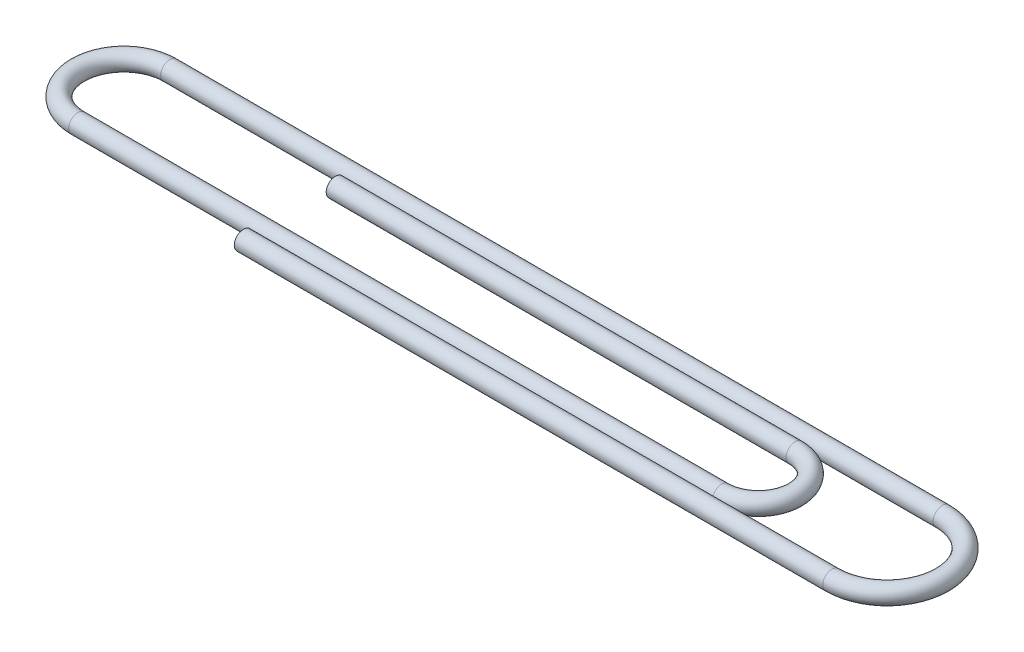
ISO-10303-21;
HEADER;
FILE_DESCRIPTION(('STEP AP214'),'2;1');
FILE_NAME('part.step','',(''),(''),'','','');
FILE_SCHEMA(('AUTOMOTIVE_DESIGN { 1 0 10303 214 1 1 1 1 }'));
ENDSEC;
DATA;
#1=APPLICATION_CONTEXT('core data for automotive mechanical design processes');
#2=APPLICATION_PROTOCOL_DEFINITION('international standard','automotive_design',2000,#1);
#3=PRODUCT_CONTEXT('',#1,'mechanical');
#4=PRODUCT('Part','Part','',(#3));
#5=PRODUCT_RELATED_PRODUCT_CATEGORY('part','',(#4));
#6=PRODUCT_DEFINITION_FORMATION('','',#4);
#7=PRODUCT_DEFINITION_CONTEXT('part definition',#1,'design');
#8=PRODUCT_DEFINITION('design','',#6,#7);
#9=PRODUCT_DEFINITION_SHAPE('','',#8);
#10=(LENGTH_UNIT() NAMED_UNIT(*) SI_UNIT(.MILLI.,.METRE.));
#11=(NAMED_UNIT(*) PLANE_ANGLE_UNIT() SI_UNIT($,.RADIAN.));
#12=(NAMED_UNIT(*) SI_UNIT($,.STERADIAN.) SOLID_ANGLE_UNIT());
#13=UNCERTAINTY_MEASURE_WITH_UNIT(LENGTH_MEASURE(1.E-05),#10,'distance_accuracy_value','');
#14=(GEOMETRIC_REPRESENTATION_CONTEXT(3) GLOBAL_UNCERTAINTY_ASSIGNED_CONTEXT((#13)) GLOBAL_UNIT_ASSIGNED_CONTEXT((#10,
#11,#12)) REPRESENTATION_CONTEXT('',''));
#15=CARTESIAN_POINT('',(0.,0.,0.));
#16=DIRECTION('',(0.,0.,1.));
#17=DIRECTION('',(1.,0.,0.));
#18=AXIS2_PLACEMENT_3D('',#15,#16,#17);
#19=CARTESIAN_POINT('',(0.,0.,0.));
#20=DIRECTION('',(-1.,0.,0.));
#21=DIRECTION('',(0.,0.,1.));
#22=AXIS2_PLACEMENT_3D('',#19,#20,#21);
#23=PLANE('',#22);
#24=CARTESIAN_POINT('',(0.,0.,0.));
#25=DIRECTION('',(-1.,0.,0.));
#26=DIRECTION('',(0.,0.,1.));
#27=AXIS2_PLACEMENT_3D('',#24,#25,#26);
#28=CIRCLE('',#27,0.49995);
#29=CARTESIAN_POINT('',(0.,0.,0.49995));
#30=VERTEX_POINT('',#29);
#31=EDGE_CURVE('E79',#30,#30,#28,.T.);
#32=ORIENTED_EDGE('',*,*,#31,.T.);
#33=EDGE_LOOP('',(#32));
#34=FACE_BOUND('',#33,.T.);
#35=ADVANCED_FACE('F51',(#34),#23,.T.);
#36=CARTESIAN_POINT('',(0.,0.,-4.99999999999997));
#37=DIRECTION('',(1.,0.,0.));
#38=DIRECTION('',(0.,0.,-1.));
#39=AXIS2_PLACEMENT_3D('',#36,#37,#38);
#40=PLANE('',#39);
#41=CARTESIAN_POINT('',(0.,0.,-4.99999999999997));
#42=DIRECTION('',(1.,0.,0.));
#43=DIRECTION('',(0.,0.,-1.));
#44=AXIS2_PLACEMENT_3D('',#41,#42,#43);
#45=CIRCLE('',#44,0.49995);
#46=CARTESIAN_POINT('',(0.,0.,-5.49994999999997));
#47=VERTEX_POINT('',#46);
#48=EDGE_CURVE('E11',#47,#47,#45,.T.);
#49=ORIENTED_EDGE('',*,*,#48,.F.);
#50=EDGE_LOOP('',(#49));
#51=FACE_BOUND('',#50,.T.);
#52=ADVANCED_FACE('F87',(#51),#40,.F.);
#53=CARTESIAN_POINT('',(0.,0.,0.));
#54=DIRECTION('',(1.,0.,0.));
#55=DIRECTION('',(0.,0.,-1.));
#56=AXIS2_PLACEMENT_3D('',#53,#54,#55);
#57=CYLINDRICAL_SURFACE('',#56,0.49995);
#58=CARTESIAN_POINT('',(32.,0.,0.));
#59=DIRECTION('',(-1.,0.,0.));
#60=DIRECTION('',(0.,0.,1.));
#61=AXIS2_PLACEMENT_3D('',#58,#59,#60);
#62=CIRCLE('',#61,0.49995);
#63=CARTESIAN_POINT('',(32.,0.,0.499949999999999));
#64=VERTEX_POINT('',#63);
#65=EDGE_CURVE('E76',#64,#64,#62,.T.);
#66=ORIENTED_EDGE('',*,*,#65,.T.);
#67=EDGE_LOOP('',(#66));
#68=FACE_BOUND('',#67,.T.);
#69=ORIENTED_EDGE('',*,*,#31,.F.);
#70=EDGE_LOOP('',(#69));
#71=FACE_BOUND('',#70,.T.);
#72=ADVANCED_FACE('F84',(#68,#71),#57,.T.);
#73=CARTESIAN_POINT('',(32.,0.,-3.));
#74=DIRECTION('',(0.,1.,0.));
#75=DIRECTION('',(0.,0.,1.));
#76=AXIS2_PLACEMENT_3D('',#73,#74,#75);
#77=TOROIDAL_SURFACE('',#76,3.,0.49995);
#78=CARTESIAN_POINT('',(32.,0.,-6.));
#79=DIRECTION('',(1.,0.,0.));
#80=DIRECTION('',(0.,0.,-1.));
#81=AXIS2_PLACEMENT_3D('',#78,#79,#80);
#82=CIRCLE('',#81,0.49995);
#83=CARTESIAN_POINT('',(32.,0.,-6.49995));
#84=VERTEX_POINT('',#83);
#85=EDGE_CURVE('E73',#84,#84,#82,.T.);
#86=CARTESIAN_POINT('',(32.,0.,-3.));
#87=DIRECTION('',(0.,1.,0.));
#88=DIRECTION('',(0.,0.,1.));
#89=AXIS2_PLACEMENT_3D('',#86,#87,#88);
#90=CIRCLE('',#89,3.49995);
#91=EDGE_CURVE('',#64,#84,#90,.T.);
#92=ORIENTED_EDGE('',*,*,#65,.F.);
#93=ORIENTED_EDGE('',*,*,#85,.T.);
#94=ORIENTED_EDGE('',*,*,#91,.T.);
#95=ORIENTED_EDGE('',*,*,#91,.F.);
#96=EDGE_LOOP('',(#92,#94,#93,#95));
#97=FACE_BOUND('',#96,.T.);
#98=ADVANCED_FACE('F86',(#97),#77,.T.);
#99=CARTESIAN_POINT('',(32.,0.,-6.));
#100=DIRECTION('',(-1.,0.,0.));
#101=DIRECTION('',(0.,0.,1.));
#102=AXIS2_PLACEMENT_3D('',#99,#100,#101);
#103=CYLINDRICAL_SURFACE('',#102,0.49995);
#104=CARTESIAN_POINT('',(-9.99999999999999,0.,-5.99999999999999));
#105=DIRECTION('',(1.,0.,0.));
#106=DIRECTION('',(0.,0.,-1.));
#107=AXIS2_PLACEMENT_3D('',#104,#105,#106);
#108=CIRCLE('',#107,0.49995);
#109=CARTESIAN_POINT('',(-9.99999999999998,0.,-6.49995));
#110=VERTEX_POINT('',#109);
#111=EDGE_CURVE('E70',#110,#110,#108,.T.);
#112=ORIENTED_EDGE('',*,*,#111,.T.);
#113=EDGE_LOOP('',(#112));
#114=FACE_BOUND('',#113,.T.);
#115=ORIENTED_EDGE('',*,*,#85,.F.);
#116=EDGE_LOOP('',(#115));
#117=FACE_BOUND('',#116,.T.);
#118=ADVANCED_FACE('F94',(#114,#117),#103,.T.);
#119=CARTESIAN_POINT('',(-10.,0.,-3.49999999999999));
#120=DIRECTION('',(0.,1.,0.));
#121=DIRECTION('',(0.,0.,1.));
#122=AXIS2_PLACEMENT_3D('',#119,#120,#121);
#123=TOROIDAL_SURFACE('',#122,2.50000000000001,0.49995);
#124=CARTESIAN_POINT('',(-10.,0.,-0.999999999999978));
#125=DIRECTION('',(-1.,0.,0.));
#126=DIRECTION('',(0.,0.,1.));
#127=AXIS2_PLACEMENT_3D('',#124,#125,#126);
#128=CIRCLE('',#127,0.49995);
#129=CARTESIAN_POINT('',(-10.,0.,-0.500049999999978));
#130=VERTEX_POINT('',#129);
#131=EDGE_CURVE('E65',#130,#130,#128,.T.);
#132=CARTESIAN_POINT('',(-10.,0.,-3.49999999999999));
#133=DIRECTION('',(0.,1.,0.));
#134=DIRECTION('',(0.,0.,1.));
#135=AXIS2_PLACEMENT_3D('',#132,#133,#134);
#136=CIRCLE('',#135,2.99995000000001);
#137=EDGE_CURVE('',#110,#130,#136,.T.);
#138=ORIENTED_EDGE('',*,*,#111,.F.);
#139=ORIENTED_EDGE('',*,*,#131,.T.);
#140=ORIENTED_EDGE('',*,*,#137,.T.);
#141=ORIENTED_EDGE('',*,*,#137,.F.);
#142=EDGE_LOOP('',(#138,#140,#139,#141));
#143=FACE_BOUND('',#142,.T.);
#144=ADVANCED_FACE('F111',(#143),#123,.T.);
#145=CARTESIAN_POINT('',(-10.,0.,-0.999999999999975));
#146=DIRECTION('',(1.,0.,0.));
#147=DIRECTION('',(0.,0.,-1.));
#148=AXIS2_PLACEMENT_3D('',#145,#146,#147);
#149=CYLINDRICAL_SURFACE('',#148,0.49995);
#150=CARTESIAN_POINT('',(25.,0.,-0.999999999999975));
#151=DIRECTION('',(-1.,0.,0.));
#152=DIRECTION('',(0.,0.,1.));
#153=AXIS2_PLACEMENT_3D('',#150,#151,#152);
#154=CIRCLE('',#153,0.49995);
#155=CARTESIAN_POINT('',(25.,0.,-0.500049999999975));
#156=VERTEX_POINT('',#155);
#157=EDGE_CURVE('E61',#156,#156,#154,.T.);
#158=ORIENTED_EDGE('',*,*,#157,.T.);
#159=EDGE_LOOP('',(#158));
#160=FACE_BOUND('',#159,.T.);
#161=ORIENTED_EDGE('',*,*,#131,.F.);
#162=EDGE_LOOP('',(#161));
#163=FACE_BOUND('',#162,.T.);
#164=ADVANCED_FACE('F105',(#160,#163),#149,.T.);
#165=CARTESIAN_POINT('',(25.,0.,-2.99999999999998));
#166=DIRECTION('',(0.,1.,0.));
#167=DIRECTION('',(0.,0.,1.));
#168=AXIS2_PLACEMENT_3D('',#165,#166,#167);
#169=TOROIDAL_SURFACE('',#168,2.,0.49995);
#170=CARTESIAN_POINT('',(25.,0.,-4.99999999999998));
#171=DIRECTION('',(1.,0.,0.));
#172=DIRECTION('',(0.,0.,-1.));
#173=AXIS2_PLACEMENT_3D('',#170,#171,#172);
#174=CIRCLE('',#173,0.49995);
#175=CARTESIAN_POINT('',(25.,0.,-5.49994999999998));
#176=VERTEX_POINT('',#175);
#177=EDGE_CURVE('E57',#176,#176,#174,.T.);
#178=CARTESIAN_POINT('',(25.,0.,-2.99999999999998));
#179=DIRECTION('',(0.,1.,0.));
#180=DIRECTION('',(0.,0.,1.));
#181=AXIS2_PLACEMENT_3D('',#178,#179,#180);
#182=CIRCLE('',#181,2.49995);
#183=EDGE_CURVE('',#156,#176,#182,.T.);
#184=ORIENTED_EDGE('',*,*,#157,.F.);
#185=ORIENTED_EDGE('',*,*,#177,.T.);
#186=ORIENTED_EDGE('',*,*,#183,.T.);
#187=ORIENTED_EDGE('',*,*,#183,.F.);
#188=EDGE_LOOP('',(#184,#186,#185,#187));
#189=FACE_BOUND('',#188,.T.);
#190=ADVANCED_FACE('F100',(#189),#169,.T.);
#191=CARTESIAN_POINT('',(25.,0.,-4.99999999999998));
#192=DIRECTION('',(-1.,0.,0.));
#193=DIRECTION('',(0.,0.,1.));
#194=AXIS2_PLACEMENT_3D('',#191,#192,#193);
#195=CYLINDRICAL_SURFACE('',#194,0.49995);
#196=ORIENTED_EDGE('',*,*,#48,.T.);
#197=EDGE_LOOP('',(#196));
#198=FACE_BOUND('',#197,.T.);
#199=ORIENTED_EDGE('',*,*,#177,.F.);
#200=EDGE_LOOP('',(#199));
#201=FACE_BOUND('',#200,.T.);
#202=ADVANCED_FACE('F98',(#198,#201),#195,.T.);
#203=CLOSED_SHELL('',(#35,#52,#72,#98,#118,#144,#164,#190,#202));
#204=MANIFOLD_SOLID_BREP('B2',#203);
#205=ADVANCED_BREP_SHAPE_REPRESENTATION('',(#18,#204),#14);
#206=SHAPE_DEFINITION_REPRESENTATION(#9,#205);
ENDSEC;
END-ISO-10303-21;
